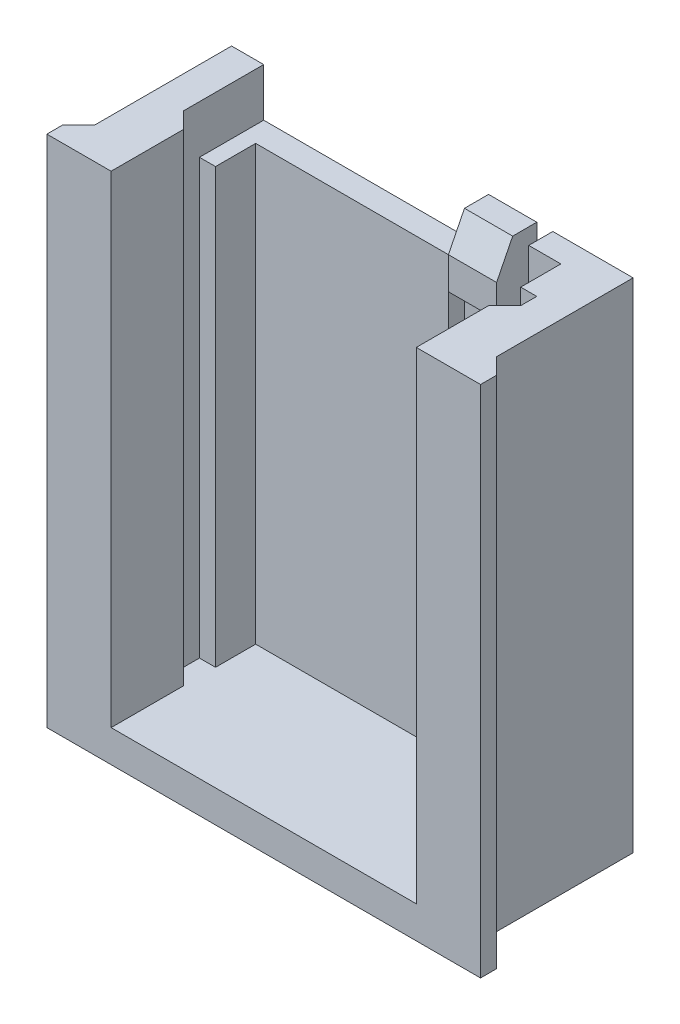
ISO-10303-21;
HEADER;
FILE_DESCRIPTION(('STEP AP214'),'2;1');
FILE_NAME('part.step','',(''),(''),'','','');
FILE_SCHEMA(('AUTOMOTIVE_DESIGN { 1 0 10303 214 1 1 1 1 }'));
ENDSEC;
DATA;
#1=APPLICATION_CONTEXT('core data for automotive mechanical design processes');
#2=APPLICATION_PROTOCOL_DEFINITION('international standard','automotive_design',2000,#1);
#3=PRODUCT_CONTEXT('',#1,'mechanical');
#4=PRODUCT('Part','Part','',(#3));
#5=PRODUCT_RELATED_PRODUCT_CATEGORY('part','',(#4));
#6=PRODUCT_DEFINITION_FORMATION('','',#4);
#7=PRODUCT_DEFINITION_CONTEXT('part definition',#1,'design');
#8=PRODUCT_DEFINITION('design','',#6,#7);
#9=PRODUCT_DEFINITION_SHAPE('','',#8);
#10=(LENGTH_UNIT() NAMED_UNIT(*) SI_UNIT(.MILLI.,.METRE.));
#11=(NAMED_UNIT(*) PLANE_ANGLE_UNIT() SI_UNIT($,.RADIAN.));
#12=(NAMED_UNIT(*) SI_UNIT($,.STERADIAN.) SOLID_ANGLE_UNIT());
#13=UNCERTAINTY_MEASURE_WITH_UNIT(LENGTH_MEASURE(1.E-05),#10,'distance_accuracy_value','');
#14=(GEOMETRIC_REPRESENTATION_CONTEXT(3) GLOBAL_UNCERTAINTY_ASSIGNED_CONTEXT((#13)) GLOBAL_UNIT_ASSIGNED_CONTEXT((#10,
#11,#12)) REPRESENTATION_CONTEXT('',''));
#15=CARTESIAN_POINT('',(0.,0.,0.));
#16=DIRECTION('',(0.,0.,1.));
#17=DIRECTION('',(1.,0.,0.));
#18=AXIS2_PLACEMENT_3D('',#15,#16,#17);
#19=CARTESIAN_POINT('',(0.,31.,0.));
#20=DIRECTION('',(0.,-1.,0.));
#21=DIRECTION('',(0.,0.,-1.));
#22=AXIS2_PLACEMENT_3D('',#19,#20,#21);
#23=PLANE('',#22);
#24=DIRECTION('',(0.,0.,1.));
#25=VECTOR('',#24,1.);
#26=CARTESIAN_POINT('',(-10.5,31.,-1.25));
#27=LINE('',#26,#25);
#28=CARTESIAN_POINT('',(-10.5,31.,-5.25));
#29=VERTEX_POINT('',#28);
#30=CARTESIAN_POINT('',(-10.5,31.,-0.249999999999987));
#31=VERTEX_POINT('',#30);
#32=EDGE_CURVE('E292',#29,#31,#27,.T.);
#33=ORIENTED_EDGE('',*,*,#32,.F.);
#34=DIRECTION('',(-1.,0.,0.));
#35=VECTOR('',#34,1.);
#36=CARTESIAN_POINT('',(-12.5,31.,-5.25));
#37=LINE('',#36,#35);
#38=CARTESIAN_POINT('',(-12.5,31.,-5.25));
#39=VERTEX_POINT('',#38);
#40=EDGE_CURVE('E361',#29,#39,#37,.T.);
#41=ORIENTED_EDGE('',*,*,#40,.T.);
#42=DIRECTION('',(0.,0.,1.));
#43=VECTOR('',#42,1.);
#44=CARTESIAN_POINT('',(-12.5,31.,5.25));
#45=LINE('',#44,#43);
#46=CARTESIAN_POINT('',(-12.5,31.,3.25000000000001));
#47=VERTEX_POINT('',#46);
#48=EDGE_CURVE('E366',#39,#47,#45,.T.);
#49=ORIENTED_EDGE('',*,*,#48,.T.);
#50=DIRECTION('',(-0.707106781186551,0.,0.707106781186544));
#51=VECTOR('',#50,1.);
#52=CARTESIAN_POINT('',(-4.62499999999993,31.,-4.62499999999998));
#53=LINE('',#52,#51);
#54=CARTESIAN_POINT('',(-13.5,31.,4.25));
#55=VERTEX_POINT('',#54);
#56=EDGE_CURVE('E274',#47,#55,#53,.T.);
#57=ORIENTED_EDGE('',*,*,#56,.T.);
#58=DIRECTION('',(0.,0.,1.));
#59=VECTOR('',#58,1.);
#60=CARTESIAN_POINT('',(-13.5,31.,4.25));
#61=LINE('',#60,#59);
#62=CARTESIAN_POINT('',(-13.5,31.,5.25));
#63=VERTEX_POINT('',#62);
#64=EDGE_CURVE('E256',#55,#63,#61,.T.);
#65=ORIENTED_EDGE('',*,*,#64,.T.);
#66=DIRECTION('',(1.,0.,0.));
#67=VECTOR('',#66,1.);
#68=CARTESIAN_POINT('',(-12.5,31.,5.25));
#69=LINE('',#68,#67);
#70=CARTESIAN_POINT('',(-9.5,31.,5.25));
#71=VERTEX_POINT('',#70);
#72=EDGE_CURVE('E370',#63,#71,#69,.T.);
#73=ORIENTED_EDGE('',*,*,#72,.T.);
#74=DIRECTION('',(0.,0.,1.));
#75=VECTOR('',#74,1.);
#76=CARTESIAN_POINT('',(-9.5,31.,0.750000000000001));
#77=LINE('',#76,#75);
#78=CARTESIAN_POINT('',(-9.5,31.,0.750000000000001));
#79=VERTEX_POINT('',#78);
#80=EDGE_CURVE('E295',#79,#71,#77,.T.);
#81=ORIENTED_EDGE('',*,*,#80,.F.);
#82=DIRECTION('',(0.707106781186552,0.,0.707106781186543));
#83=VECTOR('',#82,1.);
#84=CARTESIAN_POINT('',(-5.12499999999993,31.,5.12500000000001));
#85=LINE('',#84,#83);
#86=EDGE_CURVE('E43',#79,#31,#85,.F.);
#87=ORIENTED_EDGE('',*,*,#86,.T.);
#88=EDGE_LOOP('',(#33,#41,#49,#57,#65,#73,#81,#87));
#89=FACE_BOUND('',#88,.T.);
#90=ADVANCED_FACE('F35',(#89),#23,.F.);
#91=DIRECTION('',(0.,0.,-1.));
#92=VECTOR('',#91,1.);
#93=CARTESIAN_POINT('',(7.50000000000001,31.,0.));
#94=LINE('',#93,#92);
#95=CARTESIAN_POINT('',(7.50000000000001,31.,-3.75));
#96=VERTEX_POINT('',#95);
#97=CARTESIAN_POINT('',(7.50000000000001,31.,-5.25));
#98=VERTEX_POINT('',#97);
#99=EDGE_CURVE('E388',#96,#98,#94,.T.);
#100=ORIENTED_EDGE('',*,*,#99,.F.);
#101=DIRECTION('',(-1.,0.,0.));
#102=VECTOR('',#101,1.);
#103=CARTESIAN_POINT('',(-9.5,31.,-3.75));
#104=LINE('',#103,#102);
#105=CARTESIAN_POINT('',(9.5,31.,-3.75));
#106=VERTEX_POINT('',#105);
#107=EDGE_CURVE('E428',#106,#96,#104,.T.);
#108=ORIENTED_EDGE('',*,*,#107,.F.);
#109=DIRECTION('',(0.,0.,-1.));
#110=VECTOR('',#109,1.);
#111=CARTESIAN_POINT('',(9.5,31.,-3.75));
#112=LINE('',#111,#110);
#113=CARTESIAN_POINT('',(9.5,31.,-1.25));
#114=VERTEX_POINT('',#113);
#115=EDGE_CURVE('E442',#114,#106,#112,.T.);
#116=ORIENTED_EDGE('',*,*,#115,.F.);
#117=DIRECTION('',(-1.,0.,0.));
#118=VECTOR('',#117,1.);
#119=CARTESIAN_POINT('',(9.5,31.,-1.25));
#120=LINE('',#119,#118);
#121=CARTESIAN_POINT('',(10.5,31.,-1.25));
#122=VERTEX_POINT('',#121);
#123=EDGE_CURVE('E447',#122,#114,#120,.T.);
#124=ORIENTED_EDGE('',*,*,#123,.F.);
#125=DIRECTION('',(0.,0.,-1.));
#126=VECTOR('',#125,1.);
#127=CARTESIAN_POINT('',(10.5,31.,-1.25));
#128=LINE('',#127,#126);
#129=CARTESIAN_POINT('',(10.5,31.,-0.250000000000012));
#130=VERTEX_POINT('',#129);
#131=EDGE_CURVE('E450',#130,#122,#128,.T.);
#132=ORIENTED_EDGE('',*,*,#131,.F.);
#133=DIRECTION('',(0.707106781186544,0.,-0.707106781186551));
#134=VECTOR('',#133,1.);
#135=CARTESIAN_POINT('',(5.12500000000005,31.,5.125));
#136=LINE('',#135,#134);
#137=CARTESIAN_POINT('',(9.5,31.,0.749999999999998));
#138=VERTEX_POINT('',#137);
#139=EDGE_CURVE('E12',#130,#138,#136,.F.);
#140=ORIENTED_EDGE('',*,*,#139,.T.);
#141=DIRECTION('',(0.,0.,-1.));
#142=VECTOR('',#141,1.);
#143=CARTESIAN_POINT('',(9.5,31.,0.749999999999998));
#144=LINE('',#143,#142);
#145=CARTESIAN_POINT('',(9.5,31.,5.25));
#146=VERTEX_POINT('',#145);
#147=EDGE_CURVE('E452',#146,#138,#144,.T.);
#148=ORIENTED_EDGE('',*,*,#147,.F.);
#149=CARTESIAN_POINT('',(13.5,31.,5.25));
#150=VERTEX_POINT('',#149);
#151=EDGE_CURVE('E252',#146,#150,#69,.T.);
#152=ORIENTED_EDGE('',*,*,#151,.T.);
#153=DIRECTION('',(0.,0.,1.));
#154=VECTOR('',#153,1.);
#155=CARTESIAN_POINT('',(13.5,31.,4.25));
#156=LINE('',#155,#154);
#157=CARTESIAN_POINT('',(13.5,31.,4.25));
#158=VERTEX_POINT('',#157);
#159=EDGE_CURVE('E243',#158,#150,#156,.T.);
#160=ORIENTED_EDGE('',*,*,#159,.F.);
#161=DIRECTION('',(-0.707106781186551,0.,-0.707106781186544));
#162=VECTOR('',#161,1.);
#163=CARTESIAN_POINT('',(4.62499999999993,31.,-4.62499999999998));
#164=LINE('',#163,#162);
#165=CARTESIAN_POINT('',(12.5,31.,3.25000000000001));
#166=VERTEX_POINT('',#165);
#167=EDGE_CURVE('E248',#158,#166,#164,.T.);
#168=ORIENTED_EDGE('',*,*,#167,.T.);
#169=DIRECTION('',(0.,0.,-1.));
#170=VECTOR('',#169,1.);
#171=CARTESIAN_POINT('',(12.5,31.,5.25));
#172=LINE('',#171,#170);
#173=CARTESIAN_POINT('',(12.5,31.,-5.25));
#174=VERTEX_POINT('',#173);
#175=EDGE_CURVE('E359',#166,#174,#172,.T.);
#176=ORIENTED_EDGE('',*,*,#175,.T.);
#177=EDGE_CURVE('E363',#174,#98,#37,.T.);
#178=ORIENTED_EDGE('',*,*,#177,.T.);
#179=EDGE_LOOP('',(#100,#108,#116,#124,#132,#140,#148,#152,#160,#168,#176,#178));
#180=FACE_BOUND('',#179,.T.);
#181=ADVANCED_FACE('F246',(#180),#23,.F.);
#182=CARTESIAN_POINT('',(-9.5,-22.8473193175917,-3.75));
#183=DIRECTION('',(0.,0.,-1.));
#184=DIRECTION('',(-1.,0.,0.));
#185=AXIS2_PLACEMENT_3D('',#182,#183,#184);
#186=PLANE('',#185);
#187=DIRECTION('',(0.,1.,0.));
#188=VECTOR('',#187,1.);
#189=CARTESIAN_POINT('',(2.50000000000001,31.,-3.75));
#190=LINE('',#189,#188);
#191=CARTESIAN_POINT('',(2.50000000000001,18.,-3.75));
#192=VERTEX_POINT('',#191);
#193=CARTESIAN_POINT('',(2.50000000000001,28.,-3.75));
#194=VERTEX_POINT('',#193);
#195=EDGE_CURVE('E569',#192,#194,#190,.T.);
#196=ORIENTED_EDGE('',*,*,#195,.T.);
#197=DIRECTION('',(1.,0.,0.));
#198=VECTOR('',#197,1.);
#199=CARTESIAN_POINT('',(-10.5,28.,-3.75));
#200=LINE('',#199,#198);
#201=CARTESIAN_POINT('',(-9.5,28.,-3.75));
#202=VERTEX_POINT('',#201);
#203=EDGE_CURVE('E600',#202,#194,#200,.T.);
#204=ORIENTED_EDGE('',*,*,#203,.F.);
#205=DIRECTION('',(0.,1.,0.));
#206=VECTOR('',#205,1.);
#207=CARTESIAN_POINT('',(-9.5,-22.8473193175917,-3.75));
#208=LINE('',#207,#206);
#209=CARTESIAN_POINT('',(-9.5,1.,-3.75));
#210=VERTEX_POINT('',#209);
#211=EDGE_CURVE('E332',#210,#202,#208,.T.);
#212=ORIENTED_EDGE('',*,*,#211,.F.);
#213=DIRECTION('',(-1.,0.,0.));
#214=VECTOR('',#213,1.);
#215=CARTESIAN_POINT('',(-9.5,1.,-3.75));
#216=LINE('',#215,#214);
#217=CARTESIAN_POINT('',(9.5,1.,-3.75));
#218=VERTEX_POINT('',#217);
#219=EDGE_CURVE('E336',#218,#210,#216,.T.);
#220=ORIENTED_EDGE('',*,*,#219,.F.);
#221=DIRECTION('',(0.,1.,0.));
#222=VECTOR('',#221,1.);
#223=CARTESIAN_POINT('',(9.5,-22.8473193175917,-3.75));
#224=LINE('',#223,#222);
#225=EDGE_CURVE('E337',#218,#106,#224,.T.);
#226=ORIENTED_EDGE('',*,*,#225,.T.);
#227=ORIENTED_EDGE('',*,*,#107,.T.);
#228=DIRECTION('',(0.,-1.,0.));
#229=VECTOR('',#228,1.);
#230=CARTESIAN_POINT('',(7.50000000000001,31.,-3.75));
#231=LINE('',#230,#229);
#232=CARTESIAN_POINT('',(7.50000000000001,18.,-3.75));
#233=VERTEX_POINT('',#232);
#234=EDGE_CURVE('E435',#96,#233,#231,.T.);
#235=ORIENTED_EDGE('',*,*,#234,.T.);
#236=DIRECTION('',(-1.,0.,0.));
#237=VECTOR('',#236,1.);
#238=CARTESIAN_POINT('',(7.50000000000001,18.,-3.75));
#239=LINE('',#238,#237);
#240=CARTESIAN_POINT('',(6.50000000000001,18.,-3.75));
#241=VERTEX_POINT('',#240);
#242=EDGE_CURVE('E556',#233,#241,#239,.T.);
#243=ORIENTED_EDGE('',*,*,#242,.T.);
#244=DIRECTION('',(0.,-1.,0.));
#245=VECTOR('',#244,1.);
#246=CARTESIAN_POINT('',(6.50000000000001,31.,-3.75));
#247=LINE('',#246,#245);
#248=CARTESIAN_POINT('',(6.50000000000001,27.,-3.75));
#249=VERTEX_POINT('',#248);
#250=EDGE_CURVE('E554',#249,#241,#247,.T.);
#251=ORIENTED_EDGE('',*,*,#250,.F.);
#252=DIRECTION('',(1.,0.,0.));
#253=VECTOR('',#252,1.);
#254=CARTESIAN_POINT('',(6.50000000000001,27.,-3.75));
#255=LINE('',#254,#253);
#256=CARTESIAN_POINT('',(3.50000000000001,27.,-3.75));
#257=VERTEX_POINT('',#256);
#258=EDGE_CURVE('E537',#257,#249,#255,.T.);
#259=ORIENTED_EDGE('',*,*,#258,.F.);
#260=DIRECTION('',(0.,1.,0.));
#261=VECTOR('',#260,1.);
#262=CARTESIAN_POINT('',(3.50000000000001,31.,-3.75));
#263=LINE('',#262,#261);
#264=CARTESIAN_POINT('',(3.50000000000001,18.,-3.75));
#265=VERTEX_POINT('',#264);
#266=EDGE_CURVE('E546',#265,#257,#263,.T.);
#267=ORIENTED_EDGE('',*,*,#266,.F.);
#268=DIRECTION('',(-1.,0.,0.));
#269=VECTOR('',#268,1.);
#270=CARTESIAN_POINT('',(3.50000000000001,18.,-3.75));
#271=LINE('',#270,#269);
#272=EDGE_CURVE('E552',#265,#192,#271,.T.);
#273=ORIENTED_EDGE('',*,*,#272,.T.);
#274=EDGE_LOOP('',(#196,#204,#212,#220,#226,#227,#235,#243,#251,#259,#267,#273));
#275=FACE_BOUND('',#274,.T.);
#276=ADVANCED_FACE('F433',(#275),#186,.F.);
#277=CARTESIAN_POINT('',(12.5,31.,5.25));
#278=DIRECTION('',(-1.,0.,0.));
#279=DIRECTION('',(0.,0.,1.));
#280=AXIS2_PLACEMENT_3D('',#277,#278,#279);
#281=PLANE('',#280);
#282=ORIENTED_EDGE('',*,*,#175,.F.);
#283=DIRECTION('',(0.,-1.,0.));
#284=VECTOR('',#283,1.);
#285=CARTESIAN_POINT('',(12.5,31.,3.25000000000001));
#286=LINE('',#285,#284);
#287=CARTESIAN_POINT('',(12.5,0.,3.25000000000001));
#288=VERTEX_POINT('',#287);
#289=EDGE_CURVE('E272',#166,#288,#286,.T.);
#290=ORIENTED_EDGE('',*,*,#289,.T.);
#291=DIRECTION('',(0.,0.,-1.));
#292=VECTOR('',#291,1.);
#293=CARTESIAN_POINT('',(12.5,0.,5.25));
#294=LINE('',#293,#292);
#295=CARTESIAN_POINT('',(12.5,0.,-5.25));
#296=VERTEX_POINT('',#295);
#297=EDGE_CURVE('E358',#288,#296,#294,.T.);
#298=ORIENTED_EDGE('',*,*,#297,.T.);
#299=DIRECTION('',(0.,-1.,0.));
#300=VECTOR('',#299,1.);
#301=CARTESIAN_POINT('',(12.5,31.,-5.25));
#302=LINE('',#301,#300);
#303=EDGE_CURVE('E380',#174,#296,#302,.T.);
#304=ORIENTED_EDGE('',*,*,#303,.F.);
#305=EDGE_LOOP('',(#282,#290,#298,#304));
#306=FACE_BOUND('',#305,.T.);
#307=ADVANCED_FACE('F395',(#306),#281,.F.);
#308=CARTESIAN_POINT('',(-12.5,31.,-5.25));
#309=DIRECTION('',(0.,0.,1.));
#310=DIRECTION('',(1.,0.,0.));
#311=AXIS2_PLACEMENT_3D('',#308,#309,#310);
#312=PLANE('',#311);
#313=ORIENTED_EDGE('',*,*,#40,.F.);
#314=DIRECTION('',(0.,1.,0.));
#315=VECTOR('',#314,1.);
#316=CARTESIAN_POINT('',(-10.5,31.,-5.25));
#317=LINE('',#316,#315);
#318=CARTESIAN_POINT('',(-10.5,28.,-5.25));
#319=VERTEX_POINT('',#318);
#320=EDGE_CURVE('E304',#319,#29,#317,.T.);
#321=ORIENTED_EDGE('',*,*,#320,.F.);
#322=DIRECTION('',(-1.,0.,0.));
#323=VECTOR('',#322,1.);
#324=CARTESIAN_POINT('',(-10.5,28.,-5.25));
#325=LINE('',#324,#323);
#326=CARTESIAN_POINT('',(2.5,28.,-5.25));
#327=VERTEX_POINT('',#326);
#328=EDGE_CURVE('E595',#327,#319,#325,.T.);
#329=ORIENTED_EDGE('',*,*,#328,.F.);
#330=DIRECTION('',(0.,1.,0.));
#331=VECTOR('',#330,1.);
#332=CARTESIAN_POINT('',(2.50000000000001,31.,-5.25));
#333=LINE('',#332,#331);
#334=CARTESIAN_POINT('',(2.50000000000001,18.,-5.25));
#335=VERTEX_POINT('',#334);
#336=EDGE_CURVE('E584',#335,#327,#333,.T.);
#337=ORIENTED_EDGE('',*,*,#336,.F.);
#338=DIRECTION('',(-1.,0.,0.));
#339=VECTOR('',#338,1.);
#340=CARTESIAN_POINT('',(3.50000000000001,18.,-5.25));
#341=LINE('',#340,#339);
#342=CARTESIAN_POINT('',(3.50000000000001,18.,-5.25));
#343=VERTEX_POINT('',#342);
#344=EDGE_CURVE('E582',#343,#335,#341,.T.);
#345=ORIENTED_EDGE('',*,*,#344,.F.);
#346=DIRECTION('',(0.,1.,0.));
#347=VECTOR('',#346,1.);
#348=CARTESIAN_POINT('',(3.50000000000001,31.,-5.25));
#349=LINE('',#348,#347);
#350=CARTESIAN_POINT('',(3.50000000000001,31.,-5.25));
#351=VERTEX_POINT('',#350);
#352=EDGE_CURVE('E565',#343,#351,#349,.T.);
#353=ORIENTED_EDGE('',*,*,#352,.T.);
#354=CARTESIAN_POINT('',(6.50000000000001,31.,-5.25));
#355=VERTEX_POINT('',#354);
#356=EDGE_CURVE('E367',#355,#351,#37,.T.);
#357=ORIENTED_EDGE('',*,*,#356,.F.);
#358=DIRECTION('',(0.,-1.,0.));
#359=VECTOR('',#358,1.);
#360=CARTESIAN_POINT('',(6.50000000000001,31.,-5.25));
#361=LINE('',#360,#359);
#362=CARTESIAN_POINT('',(6.50000000000001,18.,-5.25));
#363=VERTEX_POINT('',#362);
#364=EDGE_CURVE('E551',#355,#363,#361,.T.);
#365=ORIENTED_EDGE('',*,*,#364,.T.);
#366=DIRECTION('',(-1.,0.,0.));
#367=VECTOR('',#366,1.);
#368=CARTESIAN_POINT('',(7.50000000000001,18.,-5.25));
#369=LINE('',#368,#367);
#370=CARTESIAN_POINT('',(7.50000000000001,18.,-5.25));
#371=VERTEX_POINT('',#370);
#372=EDGE_CURVE('E591',#371,#363,#369,.T.);
#373=ORIENTED_EDGE('',*,*,#372,.F.);
#374=DIRECTION('',(0.,-1.,0.));
#375=VECTOR('',#374,1.);
#376=CARTESIAN_POINT('',(7.50000000000001,31.,-5.25));
#377=LINE('',#376,#375);
#378=EDGE_CURVE('E424',#98,#371,#377,.T.);
#379=ORIENTED_EDGE('',*,*,#378,.F.);
#380=ORIENTED_EDGE('',*,*,#177,.F.);
#381=ORIENTED_EDGE('',*,*,#303,.T.);
#382=DIRECTION('',(-1.,0.,0.));
#383=VECTOR('',#382,1.);
#384=CARTESIAN_POINT('',(-12.5,0.,-5.25));
#385=LINE('',#384,#383);
#386=CARTESIAN_POINT('',(-12.5,0.,-5.25));
#387=VERTEX_POINT('',#386);
#388=EDGE_CURVE('E374',#296,#387,#385,.T.);
#389=ORIENTED_EDGE('',*,*,#388,.T.);
#390=DIRECTION('',(0.,-1.,0.));
#391=VECTOR('',#390,1.);
#392=CARTESIAN_POINT('',(-12.5,31.,-5.25));
#393=LINE('',#392,#391);
#394=EDGE_CURVE('E372',#39,#387,#393,.T.);
#395=ORIENTED_EDGE('',*,*,#394,.F.);
#396=EDGE_LOOP('',(#313,#321,#329,#337,#345,#353,#357,#365,#373,#379,#380,#381,#389,#395));
#397=FACE_BOUND('',#396,.T.);
#398=ADVANCED_FACE('F420',(#397),#312,.F.);
#399=CARTESIAN_POINT('',(-12.5,31.,5.25));
#400=DIRECTION('',(1.,0.,0.));
#401=DIRECTION('',(0.,0.,-1.));
#402=AXIS2_PLACEMENT_3D('',#399,#400,#401);
#403=PLANE('',#402);
#404=DIRECTION('',(0.,0.,1.));
#405=VECTOR('',#404,1.);
#406=CARTESIAN_POINT('',(-12.5,0.,5.25));
#407=LINE('',#406,#405);
#408=CARTESIAN_POINT('',(-12.5,0.,3.25000000000001));
#409=VERTEX_POINT('',#408);
#410=EDGE_CURVE('E362',#387,#409,#407,.T.);
#411=ORIENTED_EDGE('',*,*,#410,.T.);
#412=DIRECTION('',(0.,1.,0.));
#413=VECTOR('',#412,1.);
#414=CARTESIAN_POINT('',(-12.5,31.,3.25000000000001));
#415=LINE('',#414,#413);
#416=EDGE_CURVE('E390',#409,#47,#415,.T.);
#417=ORIENTED_EDGE('',*,*,#416,.T.);
#418=ORIENTED_EDGE('',*,*,#48,.F.);
#419=ORIENTED_EDGE('',*,*,#394,.T.);
#420=EDGE_LOOP('',(#411,#417,#418,#419));
#421=FACE_BOUND('',#420,.T.);
#422=ADVANCED_FACE('F415',(#421),#403,.F.);
#423=CARTESIAN_POINT('',(-12.5,31.,5.25));
#424=DIRECTION('',(0.,0.,-1.));
#425=DIRECTION('',(-1.,0.,0.));
#426=AXIS2_PLACEMENT_3D('',#423,#424,#425);
#427=PLANE('',#426);
#428=DIRECTION('',(1.,0.,0.));
#429=VECTOR('',#428,1.);
#430=CARTESIAN_POINT('',(-9.5,1.,5.25));
#431=LINE('',#430,#429);
#432=CARTESIAN_POINT('',(-9.5,1.,5.25));
#433=VERTEX_POINT('',#432);
#434=CARTESIAN_POINT('',(9.5,1.,5.25));
#435=VERTEX_POINT('',#434);
#436=EDGE_CURVE('E324',#433,#435,#431,.T.);
#437=ORIENTED_EDGE('',*,*,#436,.F.);
#438=DIRECTION('',(0.,1.,0.));
#439=VECTOR('',#438,1.);
#440=CARTESIAN_POINT('',(-9.5,-22.8473193175917,5.25));
#441=LINE('',#440,#439);
#442=EDGE_CURVE('E322',#433,#71,#441,.T.);
#443=ORIENTED_EDGE('',*,*,#442,.T.);
#444=ORIENTED_EDGE('',*,*,#72,.F.);
#445=DIRECTION('',(0.,1.,0.));
#446=VECTOR('',#445,1.);
#447=CARTESIAN_POINT('',(-13.5,31.,5.25));
#448=LINE('',#447,#446);
#449=CARTESIAN_POINT('',(-13.5,-1.,5.25));
#450=VERTEX_POINT('',#449);
#451=EDGE_CURVE('E612',#63,#450,#448,.F.);
#452=ORIENTED_EDGE('',*,*,#451,.T.);
#453=DIRECTION('',(1.,0.,0.));
#454=VECTOR('',#453,1.);
#455=CARTESIAN_POINT('',(-12.5,-1.,5.25));
#456=LINE('',#455,#454);
#457=CARTESIAN_POINT('',(13.5,-1.,5.25));
#458=VERTEX_POINT('',#457);
#459=EDGE_CURVE('E268',#450,#458,#456,.T.);
#460=ORIENTED_EDGE('',*,*,#459,.T.);
#461=DIRECTION('',(0.,1.,0.));
#462=VECTOR('',#461,1.);
#463=CARTESIAN_POINT('',(13.5,31.,5.25));
#464=LINE('',#463,#462);
#465=EDGE_CURVE('E283',#458,#150,#464,.T.);
#466=ORIENTED_EDGE('',*,*,#465,.T.);
#467=ORIENTED_EDGE('',*,*,#151,.F.);
#468=DIRECTION('',(0.,1.,0.));
#469=VECTOR('',#468,1.);
#470=CARTESIAN_POINT('',(9.5,-22.8473193175917,5.25));
#471=LINE('',#470,#469);
#472=EDGE_CURVE('E350',#435,#146,#471,.T.);
#473=ORIENTED_EDGE('',*,*,#472,.F.);
#474=EDGE_LOOP('',(#437,#443,#444,#452,#460,#466,#467,#473));
#475=FACE_BOUND('',#474,.T.);
#476=ADVANCED_FACE('F498',(#475),#427,.F.);
#477=CARTESIAN_POINT('',(6.50000000000001,31.,-3.75));
#478=VERTEX_POINT('',#477);
#479=CARTESIAN_POINT('',(3.50000000000001,31.,-3.75));
#480=VERTEX_POINT('',#479);
#481=EDGE_CURVE('E438',#478,#480,#104,.T.);
#482=ORIENTED_EDGE('',*,*,#481,.F.);
#483=DIRECTION('',(0.,0.,1.));
#484=VECTOR('',#483,1.);
#485=CARTESIAN_POINT('',(6.50000000000001,31.,-5.25));
#486=LINE('',#485,#484);
#487=EDGE_CURVE('E510',#355,#478,#486,.T.);
#488=ORIENTED_EDGE('',*,*,#487,.F.);
#489=ORIENTED_EDGE('',*,*,#356,.T.);
#490=DIRECTION('',(0.,0.,1.));
#491=VECTOR('',#490,1.);
#492=CARTESIAN_POINT('',(3.50000000000001,31.,-5.25));
#493=LINE('',#492,#491);
#494=EDGE_CURVE('E512',#351,#480,#493,.T.);
#495=ORIENTED_EDGE('',*,*,#494,.T.);
#496=EDGE_LOOP('',(#482,#488,#489,#495));
#497=FACE_BOUND('',#496,.T.);
#498=ADVANCED_FACE('F491',(#497),#23,.F.);
#499=CARTESIAN_POINT('',(0.,0.,0.));
#500=DIRECTION('',(0.,-1.,0.));
#501=DIRECTION('',(0.,0.,-1.));
#502=AXIS2_PLACEMENT_3D('',#499,#500,#501);
#503=PLANE('',#502);
#504=ORIENTED_EDGE('',*,*,#297,.F.);
#505=DIRECTION('',(-1.,0.,0.));
#506=VECTOR('',#505,1.);
#507=CARTESIAN_POINT('',(-12.5,0.,3.25000000000001));
#508=LINE('',#507,#506);
#509=EDGE_CURVE('E392',#288,#409,#508,.T.);
#510=ORIENTED_EDGE('',*,*,#509,.T.);
#511=ORIENTED_EDGE('',*,*,#410,.F.);
#512=ORIENTED_EDGE('',*,*,#388,.F.);
#513=EDGE_LOOP('',(#504,#510,#511,#512));
#514=FACE_BOUND('',#513,.T.);
#515=ADVANCED_FACE('F399',(#514),#503,.T.);
#516=CARTESIAN_POINT('',(0.,1.,0.));
#517=DIRECTION('',(0.,-1.,0.));
#518=DIRECTION('',(0.,0.,-1.));
#519=AXIS2_PLACEMENT_3D('',#516,#517,#518);
#520=PLANE('',#519);
#521=DIRECTION('',(0.,0.,1.));
#522=VECTOR('',#521,1.);
#523=CARTESIAN_POINT('',(-10.5,1.,-1.25));
#524=LINE('',#523,#522);
#525=CARTESIAN_POINT('',(-10.5,1.,-1.25));
#526=VERTEX_POINT('',#525);
#527=CARTESIAN_POINT('',(-10.5,1.,-0.249999999999988));
#528=VERTEX_POINT('',#527);
#529=EDGE_CURVE('E318',#526,#528,#524,.T.);
#530=ORIENTED_EDGE('',*,*,#529,.T.);
#531=DIRECTION('',(-0.707106781186552,0.,-0.707106781186543));
#532=VECTOR('',#531,1.);
#533=CARTESIAN_POINT('',(-9.5,1.,0.750000000000001));
#534=LINE('',#533,#532);
#535=CARTESIAN_POINT('',(-9.5,1.,0.750000000000001));
#536=VERTEX_POINT('',#535);
#537=EDGE_CURVE('E286',#528,#536,#534,.F.);
#538=ORIENTED_EDGE('',*,*,#537,.T.);
#539=DIRECTION('',(0.,0.,1.));
#540=VECTOR('',#539,1.);
#541=CARTESIAN_POINT('',(-9.5,1.,0.750000000000001));
#542=LINE('',#541,#540);
#543=EDGE_CURVE('E315',#536,#433,#542,.T.);
#544=ORIENTED_EDGE('',*,*,#543,.T.);
#545=ORIENTED_EDGE('',*,*,#436,.T.);
#546=DIRECTION('',(0.,0.,-1.));
#547=VECTOR('',#546,1.);
#548=CARTESIAN_POINT('',(9.5,1.,0.749999999999998));
#549=LINE('',#548,#547);
#550=CARTESIAN_POINT('',(9.5,1.,0.749999999999998));
#551=VERTEX_POINT('',#550);
#552=EDGE_CURVE('E349',#435,#551,#549,.T.);
#553=ORIENTED_EDGE('',*,*,#552,.T.);
#554=DIRECTION('',(-0.707106781186544,0.,0.707106781186551));
#555=VECTOR('',#554,1.);
#556=CARTESIAN_POINT('',(10.5,1.,-0.250000000000013));
#557=LINE('',#556,#555);
#558=CARTESIAN_POINT('',(10.5,1.,-0.250000000000012));
#559=VERTEX_POINT('',#558);
#560=EDGE_CURVE('E56',#551,#559,#557,.F.);
#561=ORIENTED_EDGE('',*,*,#560,.T.);
#562=DIRECTION('',(0.,0.,-1.));
#563=VECTOR('',#562,1.);
#564=CARTESIAN_POINT('',(10.5,1.,-1.25));
#565=LINE('',#564,#563);
#566=CARTESIAN_POINT('',(10.5,1.,-1.25));
#567=VERTEX_POINT('',#566);
#568=EDGE_CURVE('E346',#559,#567,#565,.T.);
#569=ORIENTED_EDGE('',*,*,#568,.T.);
#570=DIRECTION('',(-1.,0.,0.));
#571=VECTOR('',#570,1.);
#572=CARTESIAN_POINT('',(9.5,1.,-1.25));
#573=LINE('',#572,#571);
#574=CARTESIAN_POINT('',(9.5,1.,-1.25));
#575=VERTEX_POINT('',#574);
#576=EDGE_CURVE('E342',#567,#575,#573,.T.);
#577=ORIENTED_EDGE('',*,*,#576,.T.);
#578=DIRECTION('',(0.,0.,-1.));
#579=VECTOR('',#578,1.);
#580=CARTESIAN_POINT('',(9.5,1.,-3.75));
#581=LINE('',#580,#579);
#582=EDGE_CURVE('E339',#575,#218,#581,.T.);
#583=ORIENTED_EDGE('',*,*,#582,.T.);
#584=ORIENTED_EDGE('',*,*,#219,.T.);
#585=DIRECTION('',(0.,0.,1.));
#586=VECTOR('',#585,1.);
#587=CARTESIAN_POINT('',(-9.5,1.,-3.75));
#588=LINE('',#587,#586);
#589=CARTESIAN_POINT('',(-9.5,1.,-1.25));
#590=VERTEX_POINT('',#589);
#591=EDGE_CURVE('E335',#210,#590,#588,.T.);
#592=ORIENTED_EDGE('',*,*,#591,.T.);
#593=DIRECTION('',(-1.,0.,0.));
#594=VECTOR('',#593,1.);
#595=CARTESIAN_POINT('',(-9.5,1.,-1.25));
#596=LINE('',#595,#594);
#597=EDGE_CURVE('E354',#590,#526,#596,.T.);
#598=ORIENTED_EDGE('',*,*,#597,.T.);
#599=EDGE_LOOP('',(#530,#538,#544,#545,#553,#561,#569,#577,#583,#584,#592,#598));
#600=FACE_BOUND('',#599,.T.);
#601=ADVANCED_FACE('F313',(#600),#520,.F.);
#602=CARTESIAN_POINT('',(-9.5,-22.8473193175917,-1.25));
#603=DIRECTION('',(0.,0.,-1.));
#604=DIRECTION('',(-1.,0.,0.));
#605=AXIS2_PLACEMENT_3D('',#602,#603,#604);
#606=PLANE('',#605);
#607=DIRECTION('',(0.,1.,0.));
#608=VECTOR('',#607,1.);
#609=CARTESIAN_POINT('',(-9.5,-22.8473193175917,-1.25));
#610=LINE('',#609,#608);
#611=CARTESIAN_POINT('',(-9.5,28.,-1.25));
#612=VERTEX_POINT('',#611);
#613=EDGE_CURVE('E355',#590,#612,#610,.T.);
#614=ORIENTED_EDGE('',*,*,#613,.T.);
#615=DIRECTION('',(1.,0.,0.));
#616=VECTOR('',#615,1.);
#617=CARTESIAN_POINT('',(-10.5,28.,-1.25));
#618=LINE('',#617,#616);
#619=CARTESIAN_POINT('',(-10.5,28.,-1.25));
#620=VERTEX_POINT('',#619);
#621=EDGE_CURVE('E602',#620,#612,#618,.T.);
#622=ORIENTED_EDGE('',*,*,#621,.F.);
#623=DIRECTION('',(0.,1.,0.));
#624=VECTOR('',#623,1.);
#625=CARTESIAN_POINT('',(-10.5,-22.8473193175917,-1.25));
#626=LINE('',#625,#624);
#627=EDGE_CURVE('E331',#526,#620,#626,.T.);
#628=ORIENTED_EDGE('',*,*,#627,.F.);
#629=ORIENTED_EDGE('',*,*,#597,.F.);
#630=EDGE_LOOP('',(#614,#622,#628,#629));
#631=FACE_BOUND('',#630,.T.);
#632=ADVANCED_FACE('F633',(#631),#606,.F.);
#633=CARTESIAN_POINT('',(-10.5,-22.8473193175917,-1.25));
#634=DIRECTION('',(-1.,0.,0.));
#635=DIRECTION('',(0.,0.,1.));
#636=AXIS2_PLACEMENT_3D('',#633,#634,#635);
#637=PLANE('',#636);
#638=ORIENTED_EDGE('',*,*,#32,.T.);
#639=DIRECTION('',(0.,-1.,0.));
#640=VECTOR('',#639,1.);
#641=CARTESIAN_POINT('',(-10.5,1.,-0.249999999999987));
#642=LINE('',#641,#640);
#643=EDGE_CURVE('E273',#31,#528,#642,.T.);
#644=ORIENTED_EDGE('',*,*,#643,.T.);
#645=ORIENTED_EDGE('',*,*,#529,.F.);
#646=ORIENTED_EDGE('',*,*,#627,.T.);
#647=DIRECTION('',(0.,0.,-1.));
#648=VECTOR('',#647,1.);
#649=CARTESIAN_POINT('',(-10.5,28.,5.251));
#650=LINE('',#649,#648);
#651=EDGE_CURVE('E559',#620,#319,#650,.T.);
#652=ORIENTED_EDGE('',*,*,#651,.T.);
#653=ORIENTED_EDGE('',*,*,#320,.T.);
#654=EDGE_LOOP('',(#638,#644,#645,#646,#652,#653));
#655=FACE_BOUND('',#654,.T.);
#656=ADVANCED_FACE('F301',(#655),#637,.F.);
#657=CARTESIAN_POINT('',(-9.5,-22.8473193175917,0.750000000000001));
#658=DIRECTION('',(-1.,0.,0.));
#659=DIRECTION('',(0.,0.,1.));
#660=AXIS2_PLACEMENT_3D('',#657,#658,#659);
#661=PLANE('',#660);
#662=DIRECTION('',(0.,1.,0.));
#663=VECTOR('',#662,1.);
#664=CARTESIAN_POINT('',(-9.5,-22.8473193175917,0.750000000000001));
#665=LINE('',#664,#663);
#666=EDGE_CURVE('E310',#536,#79,#665,.T.);
#667=ORIENTED_EDGE('',*,*,#666,.T.);
#668=ORIENTED_EDGE('',*,*,#80,.T.);
#669=ORIENTED_EDGE('',*,*,#442,.F.);
#670=ORIENTED_EDGE('',*,*,#543,.F.);
#671=EDGE_LOOP('',(#667,#668,#669,#670));
#672=FACE_BOUND('',#671,.T.);
#673=ADVANCED_FACE('F320',(#672),#661,.F.);
#674=CARTESIAN_POINT('',(9.5,-22.8473193175917,0.749999999999998));
#675=DIRECTION('',(1.,0.,0.));
#676=DIRECTION('',(0.,0.,-1.));
#677=AXIS2_PLACEMENT_3D('',#674,#675,#676);
#678=PLANE('',#677);
#679=ORIENTED_EDGE('',*,*,#472,.T.);
#680=ORIENTED_EDGE('',*,*,#147,.T.);
#681=DIRECTION('',(0.,1.,0.));
#682=VECTOR('',#681,1.);
#683=CARTESIAN_POINT('',(9.5,-22.8473193175917,0.749999999999998));
#684=LINE('',#683,#682);
#685=EDGE_CURVE('E347',#551,#138,#684,.T.);
#686=ORIENTED_EDGE('',*,*,#685,.F.);
#687=ORIENTED_EDGE('',*,*,#552,.F.);
#688=EDGE_LOOP('',(#679,#680,#686,#687));
#689=FACE_BOUND('',#688,.T.);
#690=ADVANCED_FACE('F621',(#689),#678,.F.);
#691=CARTESIAN_POINT('',(10.5,-22.8473193175917,-1.25));
#692=DIRECTION('',(1.,0.,0.));
#693=DIRECTION('',(0.,0.,-1.));
#694=AXIS2_PLACEMENT_3D('',#691,#692,#693);
#695=PLANE('',#694);
#696=ORIENTED_EDGE('',*,*,#568,.F.);
#697=DIRECTION('',(0.,1.,0.));
#698=VECTOR('',#697,1.);
#699=CARTESIAN_POINT('',(10.5,31.,-0.250000000000012));
#700=LINE('',#699,#698);
#701=EDGE_CURVE('E288',#559,#130,#700,.T.);
#702=ORIENTED_EDGE('',*,*,#701,.T.);
#703=ORIENTED_EDGE('',*,*,#131,.T.);
#704=DIRECTION('',(0.,1.,0.));
#705=VECTOR('',#704,1.);
#706=CARTESIAN_POINT('',(10.5,-22.8473193175917,-1.25));
#707=LINE('',#706,#705);
#708=EDGE_CURVE('E343',#567,#122,#707,.T.);
#709=ORIENTED_EDGE('',*,*,#708,.F.);
#710=EDGE_LOOP('',(#696,#702,#703,#709));
#711=FACE_BOUND('',#710,.T.);
#712=ADVANCED_FACE('F468',(#711),#695,.F.);
#713=CARTESIAN_POINT('',(9.5,-22.8473193175917,-1.25));
#714=DIRECTION('',(0.,0.,-1.));
#715=DIRECTION('',(-1.,0.,0.));
#716=AXIS2_PLACEMENT_3D('',#713,#714,#715);
#717=PLANE('',#716);
#718=ORIENTED_EDGE('',*,*,#708,.T.);
#719=ORIENTED_EDGE('',*,*,#123,.T.);
#720=DIRECTION('',(0.,1.,0.));
#721=VECTOR('',#720,1.);
#722=CARTESIAN_POINT('',(9.5,-22.8473193175917,-1.25));
#723=LINE('',#722,#721);
#724=EDGE_CURVE('E340',#575,#114,#723,.T.);
#725=ORIENTED_EDGE('',*,*,#724,.F.);
#726=ORIENTED_EDGE('',*,*,#576,.F.);
#727=EDGE_LOOP('',(#718,#719,#725,#726));
#728=FACE_BOUND('',#727,.T.);
#729=ADVANCED_FACE('F473',(#728),#717,.F.);
#730=CARTESIAN_POINT('',(9.5,-22.8473193175917,-3.75));
#731=DIRECTION('',(1.,0.,0.));
#732=DIRECTION('',(0.,0.,-1.));
#733=AXIS2_PLACEMENT_3D('',#730,#731,#732);
#734=PLANE('',#733);
#735=ORIENTED_EDGE('',*,*,#724,.T.);
#736=ORIENTED_EDGE('',*,*,#115,.T.);
#737=ORIENTED_EDGE('',*,*,#225,.F.);
#738=ORIENTED_EDGE('',*,*,#582,.F.);
#739=EDGE_LOOP('',(#735,#736,#737,#738));
#740=FACE_BOUND('',#739,.T.);
#741=ADVANCED_FACE('F476',(#740),#734,.F.);
#742=CARTESIAN_POINT('',(-9.5,-22.8473193175917,-3.75));
#743=DIRECTION('',(-1.,0.,0.));
#744=DIRECTION('',(0.,0.,1.));
#745=AXIS2_PLACEMENT_3D('',#742,#743,#744);
#746=PLANE('',#745);
#747=ORIENTED_EDGE('',*,*,#211,.T.);
#748=DIRECTION('',(0.,0.,-1.));
#749=VECTOR('',#748,1.);
#750=CARTESIAN_POINT('',(-9.5,28.,5.251));
#751=LINE('',#750,#749);
#752=EDGE_CURVE('E604',#612,#202,#751,.T.);
#753=ORIENTED_EDGE('',*,*,#752,.F.);
#754=ORIENTED_EDGE('',*,*,#613,.F.);
#755=ORIENTED_EDGE('',*,*,#591,.F.);
#756=EDGE_LOOP('',(#747,#753,#754,#755));
#757=FACE_BOUND('',#756,.T.);
#758=ADVANCED_FACE('F478',(#757),#746,.F.);
#759=CARTESIAN_POINT('',(3.50000000000001,29.,-2.75));
#760=DIRECTION('',(1.,0.,0.));
#761=DIRECTION('',(0.,0.,-1.));
#762=AXIS2_PLACEMENT_3D('',#759,#760,#761);
#763=PLANE('',#762);
#764=DIRECTION('',(0.,-0.894427190999915,0.447213595499959));
#765=VECTOR('',#764,1.);
#766=CARTESIAN_POINT('',(3.50000000000001,29.,-2.75));
#767=LINE('',#766,#765);
#768=CARTESIAN_POINT('',(3.50000000000001,29.,-2.75));
#769=VERTEX_POINT('',#768);
#770=EDGE_CURVE('E383',#769,#480,#767,.F.);
#771=ORIENTED_EDGE('',*,*,#770,.T.);
#772=ORIENTED_EDGE('',*,*,#494,.F.);
#773=ORIENTED_EDGE('',*,*,#352,.F.);
#774=DIRECTION('',(0.,0.,1.));
#775=VECTOR('',#774,1.);
#776=CARTESIAN_POINT('',(3.50000000000001,18.,-5.25));
#777=LINE('',#776,#775);
#778=EDGE_CURVE('E548',#343,#265,#777,.T.);
#779=ORIENTED_EDGE('',*,*,#778,.T.);
#780=ORIENTED_EDGE('',*,*,#266,.T.);
#781=DIRECTION('',(0.,0.,-1.));
#782=VECTOR('',#781,1.);
#783=CARTESIAN_POINT('',(3.50000000000001,27.,-2.75));
#784=LINE('',#783,#782);
#785=CARTESIAN_POINT('',(3.50000000000001,27.,-2.75));
#786=VERTEX_POINT('',#785);
#787=EDGE_CURVE('E306',#786,#257,#784,.T.);
#788=ORIENTED_EDGE('',*,*,#787,.F.);
#789=DIRECTION('',(0.,-1.,0.));
#790=VECTOR('',#789,1.);
#791=CARTESIAN_POINT('',(3.50000000000001,29.,-2.75));
#792=LINE('',#791,#790);
#793=EDGE_CURVE('E533',#769,#786,#792,.T.);
#794=ORIENTED_EDGE('',*,*,#793,.F.);
#795=EDGE_LOOP('',(#771,#772,#773,#779,#780,#788,#794));
#796=FACE_BOUND('',#795,.T.);
#797=ADVANCED_FACE('F484',(#796),#763,.F.);
#798=CARTESIAN_POINT('',(6.50000000000001,27.,-2.75));
#799=DIRECTION('',(0.,1.,0.));
#800=DIRECTION('',(0.,0.,1.));
#801=AXIS2_PLACEMENT_3D('',#798,#799,#800);
#802=PLANE('',#801);
#803=ORIENTED_EDGE('',*,*,#258,.T.);
#804=DIRECTION('',(0.,0.,-1.));
#805=VECTOR('',#804,1.);
#806=CARTESIAN_POINT('',(6.50000000000001,27.,-2.75));
#807=LINE('',#806,#805);
#808=CARTESIAN_POINT('',(6.50000000000001,27.,-2.75));
#809=VERTEX_POINT('',#808);
#810=EDGE_CURVE('E531',#809,#249,#807,.T.);
#811=ORIENTED_EDGE('',*,*,#810,.F.);
#812=DIRECTION('',(1.,0.,0.));
#813=VECTOR('',#812,1.);
#814=CARTESIAN_POINT('',(6.50000000000001,27.,-2.75));
#815=LINE('',#814,#813);
#816=EDGE_CURVE('E528',#786,#809,#815,.T.);
#817=ORIENTED_EDGE('',*,*,#816,.F.);
#818=ORIENTED_EDGE('',*,*,#787,.T.);
#819=EDGE_LOOP('',(#803,#811,#817,#818));
#820=FACE_BOUND('',#819,.T.);
#821=ADVANCED_FACE('F542',(#820),#802,.F.);
#822=CARTESIAN_POINT('',(6.50000000000001,29.,-2.75));
#823=DIRECTION('',(-1.,0.,0.));
#824=DIRECTION('',(0.,0.,1.));
#825=AXIS2_PLACEMENT_3D('',#822,#823,#824);
#826=PLANE('',#825);
#827=ORIENTED_EDGE('',*,*,#810,.T.);
#828=ORIENTED_EDGE('',*,*,#250,.T.);
#829=DIRECTION('',(0.,0.,1.));
#830=VECTOR('',#829,1.);
#831=CARTESIAN_POINT('',(6.50000000000001,18.,-5.25));
#832=LINE('',#831,#830);
#833=EDGE_CURVE('E579',#363,#241,#832,.T.);
#834=ORIENTED_EDGE('',*,*,#833,.F.);
#835=ORIENTED_EDGE('',*,*,#364,.F.);
#836=ORIENTED_EDGE('',*,*,#487,.T.);
#837=DIRECTION('',(0.,0.894427190999915,-0.447213595499959));
#838=VECTOR('',#837,1.);
#839=CARTESIAN_POINT('',(6.50000000000001,29.,-2.75));
#840=LINE('',#839,#838);
#841=CARTESIAN_POINT('',(6.50000000000001,29.,-2.75));
#842=VERTEX_POINT('',#841);
#843=EDGE_CURVE('E386',#478,#842,#840,.F.);
#844=ORIENTED_EDGE('',*,*,#843,.T.);
#845=DIRECTION('',(0.,1.,0.));
#846=VECTOR('',#845,1.);
#847=CARTESIAN_POINT('',(6.50000000000001,29.,-2.75));
#848=LINE('',#847,#846);
#849=EDGE_CURVE('E523',#809,#842,#848,.T.);
#850=ORIENTED_EDGE('',*,*,#849,.F.);
#851=EDGE_LOOP('',(#827,#828,#834,#835,#836,#844,#850));
#852=FACE_BOUND('',#851,.T.);
#853=ADVANCED_FACE('F522',(#852),#826,.F.);
#854=CARTESIAN_POINT('',(0.,0.,-2.75));
#855=DIRECTION('',(0.,0.,-1.));
#856=DIRECTION('',(-1.,0.,0.));
#857=AXIS2_PLACEMENT_3D('',#854,#855,#856);
#858=PLANE('',#857);
#859=ORIENTED_EDGE('',*,*,#793,.T.);
#860=ORIENTED_EDGE('',*,*,#816,.T.);
#861=ORIENTED_EDGE('',*,*,#849,.T.);
#862=DIRECTION('',(-1.,0.,0.));
#863=VECTOR('',#862,1.);
#864=CARTESIAN_POINT('',(6.50000000000001,29.,-2.75));
#865=LINE('',#864,#863);
#866=EDGE_CURVE('E517',#842,#769,#865,.T.);
#867=ORIENTED_EDGE('',*,*,#866,.T.);
#868=EDGE_LOOP('',(#859,#860,#861,#867));
#869=FACE_BOUND('',#868,.T.);
#870=ADVANCED_FACE('F526',(#869),#858,.F.);
#871=CARTESIAN_POINT('',(6.50000000000001,29.,-2.75));
#872=DIRECTION('',(0.,0.447213595499959,0.894427190999915));
#873=DIRECTION('',(1.,0.,0.));
#874=AXIS2_PLACEMENT_3D('',#871,#872,#873);
#875=PLANE('',#874);
#876=ORIENTED_EDGE('',*,*,#843,.F.);
#877=ORIENTED_EDGE('',*,*,#481,.T.);
#878=ORIENTED_EDGE('',*,*,#770,.F.);
#879=ORIENTED_EDGE('',*,*,#866,.F.);
#880=EDGE_LOOP('',(#876,#877,#878,#879));
#881=FACE_BOUND('',#880,.T.);
#882=ADVANCED_FACE('F515',(#881),#875,.T.);
#883=CARTESIAN_POINT('',(7.50000000000001,31.,-5.25));
#884=DIRECTION('',(-1.,0.,0.));
#885=DIRECTION('',(0.,-1.,0.));
#886=AXIS2_PLACEMENT_3D('',#883,#884,#885);
#887=PLANE('',#886);
#888=ORIENTED_EDGE('',*,*,#99,.T.);
#889=ORIENTED_EDGE('',*,*,#378,.T.);
#890=DIRECTION('',(0.,0.,1.));
#891=VECTOR('',#890,1.);
#892=CARTESIAN_POINT('',(7.50000000000001,18.,-5.25));
#893=LINE('',#892,#891);
#894=EDGE_CURVE('E577',#371,#233,#893,.T.);
#895=ORIENTED_EDGE('',*,*,#894,.T.);
#896=ORIENTED_EDGE('',*,*,#234,.F.);
#897=EDGE_LOOP('',(#888,#889,#895,#896));
#898=FACE_BOUND('',#897,.T.);
#899=ADVANCED_FACE('F754',(#898),#887,.T.);
#900=CARTESIAN_POINT('',(7.50000000000001,18.,-5.25));
#901=DIRECTION('',(0.,1.,0.));
#902=DIRECTION('',(0.,0.,1.));
#903=AXIS2_PLACEMENT_3D('',#900,#901,#902);
#904=PLANE('',#903);
#905=ORIENTED_EDGE('',*,*,#242,.F.);
#906=ORIENTED_EDGE('',*,*,#894,.F.);
#907=ORIENTED_EDGE('',*,*,#372,.T.);
#908=ORIENTED_EDGE('',*,*,#833,.T.);
#909=EDGE_LOOP('',(#905,#906,#907,#908));
#910=FACE_BOUND('',#909,.T.);
#911=ADVANCED_FACE('F747',(#910),#904,.T.);
#912=CARTESIAN_POINT('',(2.50000000000001,31.,-5.25));
#913=DIRECTION('',(1.,0.,0.));
#914=DIRECTION('',(0.,1.,0.));
#915=AXIS2_PLACEMENT_3D('',#912,#913,#914);
#916=PLANE('',#915);
#917=DIRECTION('',(0.,0.,-1.));
#918=VECTOR('',#917,1.);
#919=CARTESIAN_POINT('',(2.5,28.,5.251));
#920=LINE('',#919,#918);
#921=EDGE_CURVE('E562',#194,#327,#920,.T.);
#922=ORIENTED_EDGE('',*,*,#921,.F.);
#923=ORIENTED_EDGE('',*,*,#195,.F.);
#924=DIRECTION('',(0.,0.,1.));
#925=VECTOR('',#924,1.);
#926=CARTESIAN_POINT('',(2.50000000000001,18.,-5.25));
#927=LINE('',#926,#925);
#928=EDGE_CURVE('E575',#335,#192,#927,.T.);
#929=ORIENTED_EDGE('',*,*,#928,.F.);
#930=ORIENTED_EDGE('',*,*,#336,.T.);
#931=EDGE_LOOP('',(#922,#923,#929,#930));
#932=FACE_BOUND('',#931,.T.);
#933=ADVANCED_FACE('F739',(#932),#916,.T.);
#934=CARTESIAN_POINT('',(3.50000000000001,18.,-5.25));
#935=DIRECTION('',(0.,1.,0.));
#936=DIRECTION('',(0.,0.,1.));
#937=AXIS2_PLACEMENT_3D('',#934,#935,#936);
#938=PLANE('',#937);
#939=ORIENTED_EDGE('',*,*,#272,.F.);
#940=ORIENTED_EDGE('',*,*,#778,.F.);
#941=ORIENTED_EDGE('',*,*,#344,.T.);
#942=ORIENTED_EDGE('',*,*,#928,.T.);
#943=EDGE_LOOP('',(#939,#940,#941,#942));
#944=FACE_BOUND('',#943,.T.);
#945=ADVANCED_FACE('F729',(#944),#938,.T.);
#946=CARTESIAN_POINT('',(-10.5,28.,5.251));
#947=DIRECTION('',(0.,-1.,0.));
#948=DIRECTION('',(1.,0.,0.));
#949=AXIS2_PLACEMENT_3D('',#946,#947,#948);
#950=PLANE('',#949);
#951=ORIENTED_EDGE('',*,*,#203,.T.);
#952=ORIENTED_EDGE('',*,*,#921,.T.);
#953=ORIENTED_EDGE('',*,*,#328,.T.);
#954=ORIENTED_EDGE('',*,*,#651,.F.);
#955=ORIENTED_EDGE('',*,*,#621,.T.);
#956=ORIENTED_EDGE('',*,*,#752,.T.);
#957=EDGE_LOOP('',(#951,#952,#953,#954,#955,#956));
#958=FACE_BOUND('',#957,.T.);
#959=ADVANCED_FACE('F722',(#958),#950,.F.);
#960=CARTESIAN_POINT('',(13.5,31.,4.25));
#961=DIRECTION('',(1.,0.,0.));
#962=DIRECTION('',(0.,0.,-1.));
#963=AXIS2_PLACEMENT_3D('',#960,#961,#962);
#964=PLANE('',#963);
#965=ORIENTED_EDGE('',*,*,#465,.F.);
#966=DIRECTION('',(0.,0.,1.));
#967=VECTOR('',#966,1.);
#968=CARTESIAN_POINT('',(13.5,-1.,4.25));
#969=LINE('',#968,#967);
#970=CARTESIAN_POINT('',(13.5,-1.,4.25));
#971=VERTEX_POINT('',#970);
#972=EDGE_CURVE('E262',#971,#458,#969,.T.);
#973=ORIENTED_EDGE('',*,*,#972,.F.);
#974=DIRECTION('',(0.,1.,0.));
#975=VECTOR('',#974,1.);
#976=CARTESIAN_POINT('',(13.5,31.,4.25));
#977=LINE('',#976,#975);
#978=EDGE_CURVE('E260',#971,#158,#977,.T.);
#979=ORIENTED_EDGE('',*,*,#978,.T.);
#980=ORIENTED_EDGE('',*,*,#159,.T.);
#981=EDGE_LOOP('',(#965,#973,#979,#980));
#982=FACE_BOUND('',#981,.T.);
#983=ADVANCED_FACE('F261',(#982),#964,.T.);
#984=CARTESIAN_POINT('',(-12.5,-1.,4.25));
#985=DIRECTION('',(0.,-1.,0.));
#986=DIRECTION('',(0.,0.,-1.));
#987=AXIS2_PLACEMENT_3D('',#984,#985,#986);
#988=PLANE('',#987);
#989=ORIENTED_EDGE('',*,*,#459,.F.);
#990=DIRECTION('',(0.,0.,1.));
#991=VECTOR('',#990,1.);
#992=CARTESIAN_POINT('',(-13.5,-1.,4.25));
#993=LINE('',#992,#991);
#994=CARTESIAN_POINT('',(-13.5,-1.,4.25));
#995=VERTEX_POINT('',#994);
#996=EDGE_CURVE('E607',#995,#450,#993,.T.);
#997=ORIENTED_EDGE('',*,*,#996,.F.);
#998=DIRECTION('',(1.,0.,0.));
#999=VECTOR('',#998,1.);
#1000=CARTESIAN_POINT('',(-12.5,-1.,4.25));
#1001=LINE('',#1000,#999);
#1002=EDGE_CURVE('E257',#995,#971,#1001,.T.);
#1003=ORIENTED_EDGE('',*,*,#1002,.T.);
#1004=ORIENTED_EDGE('',*,*,#972,.T.);
#1005=EDGE_LOOP('',(#989,#997,#1003,#1004));
#1006=FACE_BOUND('',#1005,.T.);
#1007=ADVANCED_FACE('F708',(#1006),#988,.T.);
#1008=CARTESIAN_POINT('',(-13.5,31.,4.25));
#1009=DIRECTION('',(-1.,0.,0.));
#1010=DIRECTION('',(0.,0.,1.));
#1011=AXIS2_PLACEMENT_3D('',#1008,#1009,#1010);
#1012=PLANE('',#1011);
#1013=ORIENTED_EDGE('',*,*,#451,.F.);
#1014=ORIENTED_EDGE('',*,*,#64,.F.);
#1015=DIRECTION('',(0.,1.,0.));
#1016=VECTOR('',#1015,1.);
#1017=CARTESIAN_POINT('',(-13.5,31.,4.25));
#1018=LINE('',#1017,#1016);
#1019=EDGE_CURVE('E267',#55,#995,#1018,.F.);
#1020=ORIENTED_EDGE('',*,*,#1019,.T.);
#1021=ORIENTED_EDGE('',*,*,#996,.T.);
#1022=EDGE_LOOP('',(#1013,#1014,#1020,#1021));
#1023=FACE_BOUND('',#1022,.T.);
#1024=ADVANCED_FACE('F619',(#1023),#1012,.T.);
#1025=CARTESIAN_POINT('',(13.5,0.,4.25));
#1026=DIRECTION('',(-0.707106781186544,0.,0.707106781186551));
#1027=DIRECTION('',(0.,1.,0.));
#1028=AXIS2_PLACEMENT_3D('',#1025,#1026,#1027);
#1029=PLANE('',#1028);
#1030=ORIENTED_EDGE('',*,*,#167,.F.);
#1031=ORIENTED_EDGE('',*,*,#978,.F.);
#1032=DIRECTION('',(0.577350269189628,-0.577350269189628,0.577350269189622));
#1033=VECTOR('',#1032,1.);
#1034=CARTESIAN_POINT('',(13.1666666666667,-0.666666666666665,3.91666666666667));
#1035=LINE('',#1034,#1033);
#1036=EDGE_CURVE('E282',#288,#971,#1035,.T.);
#1037=ORIENTED_EDGE('',*,*,#1036,.F.);
#1038=ORIENTED_EDGE('',*,*,#289,.F.);
#1039=EDGE_LOOP('',(#1030,#1031,#1037,#1038));
#1040=FACE_BOUND('',#1039,.T.);
#1041=ADVANCED_FACE('F271',(#1040),#1029,.F.);
#1042=CARTESIAN_POINT('',(0.,-1.,4.25));
#1043=DIRECTION('',(0.,-0.707106781186544,-0.707106781186551));
#1044=DIRECTION('',(-1.,0.,0.));
#1045=AXIS2_PLACEMENT_3D('',#1042,#1043,#1044);
#1046=PLANE('',#1045);
#1047=ORIENTED_EDGE('',*,*,#1036,.T.);
#1048=ORIENTED_EDGE('',*,*,#1002,.F.);
#1049=DIRECTION('',(-0.577350269189628,-0.577350269189628,0.577350269189622));
#1050=VECTOR('',#1049,1.);
#1051=CARTESIAN_POINT('',(-8.99999999999997,3.50000000000003,-0.249999999999984));
#1052=LINE('',#1051,#1050);
#1053=EDGE_CURVE('E280',#409,#995,#1052,.T.);
#1054=ORIENTED_EDGE('',*,*,#1053,.F.);
#1055=ORIENTED_EDGE('',*,*,#509,.F.);
#1056=EDGE_LOOP('',(#1047,#1048,#1054,#1055));
#1057=FACE_BOUND('',#1056,.T.);
#1058=ADVANCED_FACE('F405',(#1057),#1046,.T.);
#1059=CARTESIAN_POINT('',(-13.5,0.,4.25));
#1060=DIRECTION('',(0.707106781186544,0.,0.707106781186551));
#1061=DIRECTION('',(0.,-1.,0.));
#1062=AXIS2_PLACEMENT_3D('',#1059,#1060,#1061);
#1063=PLANE('',#1062);
#1064=ORIENTED_EDGE('',*,*,#56,.F.);
#1065=ORIENTED_EDGE('',*,*,#416,.F.);
#1066=ORIENTED_EDGE('',*,*,#1053,.T.);
#1067=ORIENTED_EDGE('',*,*,#1019,.F.);
#1068=EDGE_LOOP('',(#1064,#1065,#1066,#1067));
#1069=FACE_BOUND('',#1068,.T.);
#1070=ADVANCED_FACE('F411',(#1069),#1063,.F.);
#1071=CARTESIAN_POINT('',(-9.5,-22.8473193175917,0.750000000000001));
#1072=DIRECTION('',(0.707106781186543,0.,-0.707106781186552));
#1073=DIRECTION('',(0.,-1.,0.));
#1074=AXIS2_PLACEMENT_3D('',#1071,#1072,#1073);
#1075=PLANE('',#1074);
#1076=ORIENTED_EDGE('',*,*,#537,.F.);
#1077=ORIENTED_EDGE('',*,*,#643,.F.);
#1078=ORIENTED_EDGE('',*,*,#86,.F.);
#1079=ORIENTED_EDGE('',*,*,#666,.F.);
#1080=EDGE_LOOP('',(#1076,#1077,#1078,#1079));
#1081=FACE_BOUND('',#1080,.T.);
#1082=ADVANCED_FACE('F309',(#1081),#1075,.T.);
#1083=CARTESIAN_POINT('',(10.5,-22.8473193175917,-0.250000000000013));
#1084=DIRECTION('',(-0.707106781186551,0.,-0.707106781186544));
#1085=DIRECTION('',(0.,-1.,0.));
#1086=AXIS2_PLACEMENT_3D('',#1083,#1084,#1085);
#1087=PLANE('',#1086);
#1088=ORIENTED_EDGE('',*,*,#560,.F.);
#1089=ORIENTED_EDGE('',*,*,#685,.T.);
#1090=ORIENTED_EDGE('',*,*,#139,.F.);
#1091=ORIENTED_EDGE('',*,*,#701,.F.);
#1092=EDGE_LOOP('',(#1088,#1089,#1090,#1091));
#1093=FACE_BOUND('',#1092,.T.);
#1094=ADVANCED_FACE('F37',(#1093),#1087,.T.);
#1095=CLOSED_SHELL('',(#90,#181,#276,#307,#398,#422,#476,#498,#515,#601,#632,#656,#673,#690,
#712,#729,#741,#758,#797,#821,#853,#870,#882,#899,#911,#933,#945,#959,#983,#1007,#1024,#1041,
#1058,#1070,#1082,#1094));
#1096=MANIFOLD_SOLID_BREP('B2',#1095);
#1097=ADVANCED_BREP_SHAPE_REPRESENTATION('',(#18,#1096),#14);
#1098=SHAPE_DEFINITION_REPRESENTATION(#9,#1097);
ENDSEC;
END-ISO-10303-21;
